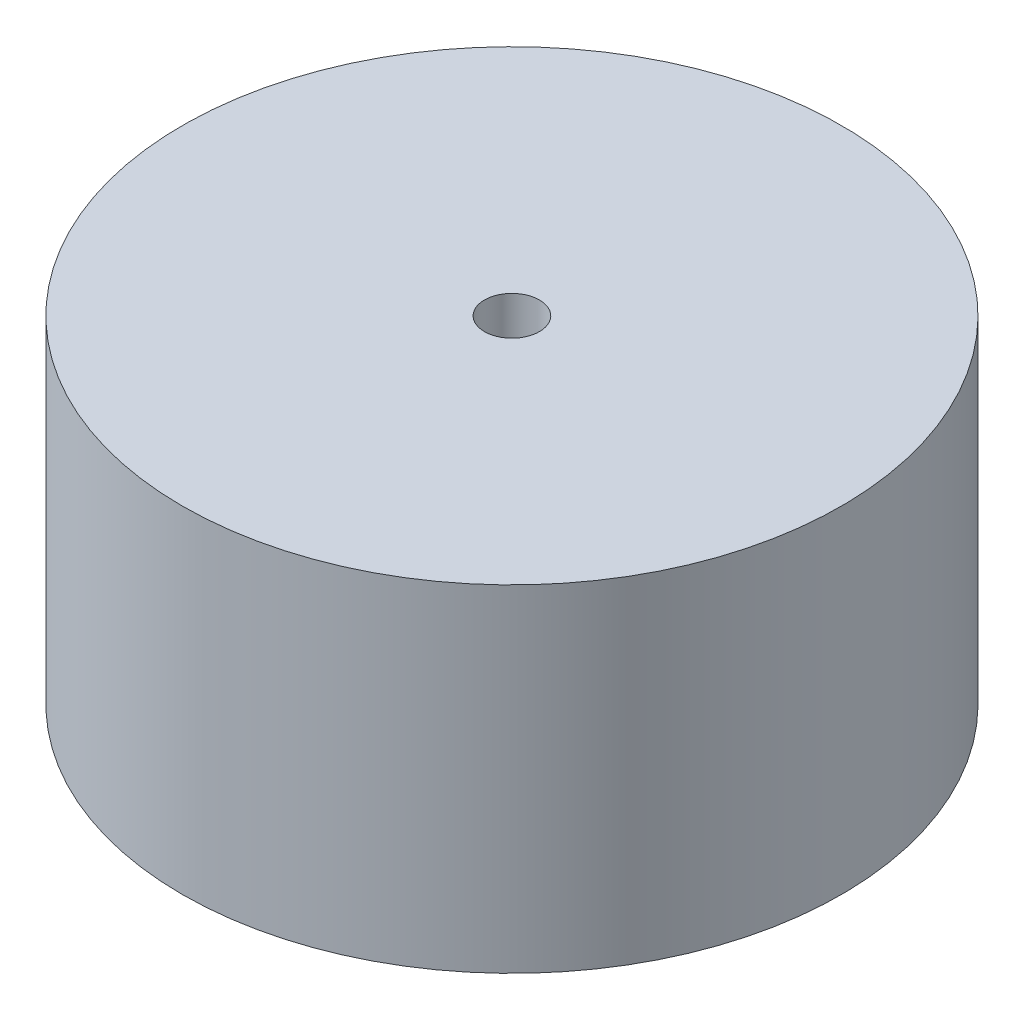
ISO-10303-21;
HEADER;
FILE_DESCRIPTION(('STEP AP214'),'2;1');
FILE_NAME('part.step','',(''),(''),'','','');
FILE_SCHEMA(('AUTOMOTIVE_DESIGN { 1 0 10303 214 1 1 1 1 }'));
ENDSEC;
DATA;
#1=APPLICATION_CONTEXT('core data for automotive mechanical design processes');
#2=APPLICATION_PROTOCOL_DEFINITION('international standard','automotive_design',2000,#1);
#3=PRODUCT_CONTEXT('',#1,'mechanical');
#4=PRODUCT('Part','Part','',(#3));
#5=PRODUCT_RELATED_PRODUCT_CATEGORY('part','',(#4));
#6=PRODUCT_DEFINITION_FORMATION('','',#4);
#7=PRODUCT_DEFINITION_CONTEXT('part definition',#1,'design');
#8=PRODUCT_DEFINITION('design','',#6,#7);
#9=PRODUCT_DEFINITION_SHAPE('','',#8);
#10=(LENGTH_UNIT() NAMED_UNIT(*) SI_UNIT(.MILLI.,.METRE.));
#11=(NAMED_UNIT(*) PLANE_ANGLE_UNIT() SI_UNIT($,.RADIAN.));
#12=(NAMED_UNIT(*) SI_UNIT($,.STERADIAN.) SOLID_ANGLE_UNIT());
#13=UNCERTAINTY_MEASURE_WITH_UNIT(LENGTH_MEASURE(1.E-05),#10,'distance_accuracy_value','');
#14=(GEOMETRIC_REPRESENTATION_CONTEXT(3) GLOBAL_UNCERTAINTY_ASSIGNED_CONTEXT((#13)) GLOBAL_UNIT_ASSIGNED_CONTEXT((#10,
#11,#12)) REPRESENTATION_CONTEXT('',''));
#15=CARTESIAN_POINT('',(0.,0.,0.));
#16=DIRECTION('',(0.,0.,1.));
#17=DIRECTION('',(1.,0.,0.));
#18=AXIS2_PLACEMENT_3D('',#15,#16,#17);
#19=CARTESIAN_POINT('',(0.,24.5,0.));
#20=DIRECTION('',(0.,-1.,0.));
#21=DIRECTION('',(0.,0.,-1.));
#22=AXIS2_PLACEMENT_3D('',#19,#20,#21);
#23=CYLINDRICAL_SURFACE('',#22,24.);
#24=CARTESIAN_POINT('',(0.,24.5,0.));
#25=DIRECTION('',(0.,1.,0.));
#26=DIRECTION('',(0.,0.,1.));
#27=AXIS2_PLACEMENT_3D('',#24,#25,#26);
#28=CIRCLE('',#27,24.);
#29=CARTESIAN_POINT('',(0.,24.5,24.));
#30=VERTEX_POINT('',#29);
#31=EDGE_CURVE('E10',#30,#30,#28,.T.);
#32=ORIENTED_EDGE('',*,*,#31,.F.);
#33=EDGE_LOOP('',(#32));
#34=FACE_BOUND('',#33,.T.);
#35=CARTESIAN_POINT('',(0.,0.,0.));
#36=DIRECTION('',(0.,1.,0.));
#37=DIRECTION('',(0.,0.,1.));
#38=AXIS2_PLACEMENT_3D('',#35,#36,#37);
#39=CIRCLE('',#38,24.);
#40=CARTESIAN_POINT('',(0.,0.,24.));
#41=VERTEX_POINT('',#40);
#42=EDGE_CURVE('E34',#41,#41,#39,.T.);
#43=ORIENTED_EDGE('',*,*,#42,.T.);
#44=EDGE_LOOP('',(#43));
#45=FACE_BOUND('',#44,.T.);
#46=ADVANCED_FACE('F31',(#34,#45),#23,.T.);
#47=CARTESIAN_POINT('',(0.,24.5,0.));
#48=DIRECTION('',(0.,1.,0.));
#49=DIRECTION('',(0.,0.,1.));
#50=AXIS2_PLACEMENT_3D('',#47,#48,#49);
#51=PLANE('',#50);
#52=CARTESIAN_POINT('',(0.,24.5,0.));
#53=DIRECTION('',(0.,1.,0.));
#54=DIRECTION('',(0.,0.,1.));
#55=AXIS2_PLACEMENT_3D('',#52,#53,#54);
#56=CIRCLE('',#55,2.);
#57=CARTESIAN_POINT('',(0.,24.5,2.));
#58=VERTEX_POINT('',#57);
#59=EDGE_CURVE('E41',#58,#58,#56,.T.);
#60=ORIENTED_EDGE('',*,*,#59,.F.);
#61=EDGE_LOOP('',(#60));
#62=FACE_BOUND('',#61,.T.);
#63=ORIENTED_EDGE('',*,*,#31,.T.);
#64=EDGE_LOOP('',(#63));
#65=FACE_BOUND('',#64,.T.);
#66=ADVANCED_FACE('F60',(#62,#65),#51,.T.);
#67=CARTESIAN_POINT('',(0.,0.,0.));
#68=DIRECTION('',(0.,1.,0.));
#69=DIRECTION('',(0.,0.,1.));
#70=AXIS2_PLACEMENT_3D('',#67,#68,#69);
#71=PLANE('',#70);
#72=CARTESIAN_POINT('',(0.,0.,0.));
#73=DIRECTION('',(0.,1.,0.));
#74=DIRECTION('',(0.,0.,1.));
#75=AXIS2_PLACEMENT_3D('',#72,#73,#74);
#76=CIRCLE('',#75,2.);
#77=CARTESIAN_POINT('',(0.,0.,2.));
#78=VERTEX_POINT('',#77);
#79=EDGE_CURVE('E45',#78,#78,#76,.T.);
#80=ORIENTED_EDGE('',*,*,#79,.T.);
#81=EDGE_LOOP('',(#80));
#82=FACE_BOUND('',#81,.T.);
#83=ORIENTED_EDGE('',*,*,#42,.F.);
#84=EDGE_LOOP('',(#83));
#85=FACE_BOUND('',#84,.T.);
#86=ADVANCED_FACE('F49',(#82,#85),#71,.F.);
#87=CARTESIAN_POINT('',(0.,0.,0.));
#88=DIRECTION('',(0.,1.,0.));
#89=DIRECTION('',(0.,0.,1.));
#90=AXIS2_PLACEMENT_3D('',#87,#88,#89);
#91=CYLINDRICAL_SURFACE('',#90,2.);
#92=ORIENTED_EDGE('',*,*,#59,.T.);
#93=EDGE_LOOP('',(#92));
#94=FACE_BOUND('',#93,.T.);
#95=ORIENTED_EDGE('',*,*,#79,.F.);
#96=EDGE_LOOP('',(#95));
#97=FACE_BOUND('',#96,.T.);
#98=ADVANCED_FACE('F52',(#94,#97),#91,.F.);
#99=CLOSED_SHELL('',(#46,#66,#86,#98));
#100=MANIFOLD_SOLID_BREP('B2',#99);
#101=ADVANCED_BREP_SHAPE_REPRESENTATION('',(#18,#100),#14);
#102=SHAPE_DEFINITION_REPRESENTATION(#9,#101);
ENDSEC;
END-ISO-10303-21;
